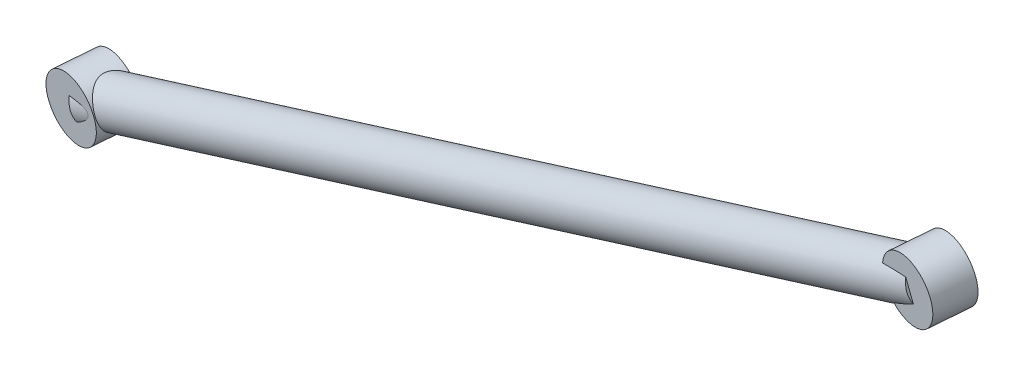
ISO-10303-21;
HEADER;
FILE_DESCRIPTION(('STEP AP214'),'2;1');
FILE_NAME('part.step','',(''),(''),'','','');
FILE_SCHEMA(('AUTOMOTIVE_DESIGN { 1 0 10303 214 1 1 1 1 }'));
ENDSEC;
DATA;
#1=APPLICATION_CONTEXT('core data for automotive mechanical design processes');
#2=APPLICATION_PROTOCOL_DEFINITION('international standard','automotive_design',2000,#1);
#3=PRODUCT_CONTEXT('',#1,'mechanical');
#4=PRODUCT('Part','Part','',(#3));
#5=PRODUCT_RELATED_PRODUCT_CATEGORY('part','',(#4));
#6=PRODUCT_DEFINITION_FORMATION('','',#4);
#7=PRODUCT_DEFINITION_CONTEXT('part definition',#1,'design');
#8=PRODUCT_DEFINITION('design','',#6,#7);
#9=PRODUCT_DEFINITION_SHAPE('','',#8);
#10=(LENGTH_UNIT() NAMED_UNIT(*) SI_UNIT(.MILLI.,.METRE.));
#11=(NAMED_UNIT(*) PLANE_ANGLE_UNIT() SI_UNIT($,.RADIAN.));
#12=(NAMED_UNIT(*) SI_UNIT($,.STERADIAN.) SOLID_ANGLE_UNIT());
#13=UNCERTAINTY_MEASURE_WITH_UNIT(LENGTH_MEASURE(1.E-05),#10,'distance_accuracy_value','');
#14=(GEOMETRIC_REPRESENTATION_CONTEXT(3) GLOBAL_UNCERTAINTY_ASSIGNED_CONTEXT((#13)) GLOBAL_UNIT_ASSIGNED_CONTEXT((#10,
#11,#12)) REPRESENTATION_CONTEXT('',''));
#15=CARTESIAN_POINT('',(0.,0.,0.));
#16=DIRECTION('',(0.,0.,1.));
#17=DIRECTION('',(1.,0.,0.));
#18=AXIS2_PLACEMENT_3D('',#15,#16,#17);
#19=CARTESIAN_POINT('',(-270.,-90.4,-82.3915));
#20=DIRECTION('',(-0.939705089189174,-0.336195624096405,-0.0626645648703886));
#21=DIRECTION('',(0.336857669052995,-0.941555580303246,0.));
#22=AXIS2_PLACEMENT_3D('',#19,#20,#21);
#23=PLANE('',#22);
#24=DIRECTION('',(0.338112197345584,-0.940832147772697,-0.0226938697351189));
#25=VECTOR('',#24,1.);
#26=CARTESIAN_POINT('',(-270.362363465706,-90.7001374074665,-75.3473327454949));
#27=LINE('',#26,#25);
#28=CARTESIAN_POINT('',(-271.63459650136,-87.1600174449255,-75.261941295525));
#29=VERTEX_POINT('',#28);
#30=CARTESIAN_POINT('',(-269.090130430052,-94.2402573700075,-75.4327241954648));
#31=VERTEX_POINT('',#30);
#32=EDGE_CURVE('E214',#29,#31,#27,.T.);
#33=ORIENTED_EDGE('',*,*,#32,.F.);
#34=CARTESIAN_POINT('',(-270.,-90.4,-82.3915));
#35=DIRECTION('',(-0.939705089189174,-0.336195624096405,-0.0626645648703886));
#36=DIRECTION('',(0.336857669052995,-0.941555580303246,0.));
#37=AXIS2_PLACEMENT_3D('',#34,#35,#36);
#38=CIRCLE('',#37,8.);
#39=EDGE_CURVE('E121',#31,#29,#38,.T.);
#40=ORIENTED_EDGE('',*,*,#39,.F.);
#41=EDGE_LOOP('',(#33,#40));
#42=FACE_BOUND('',#41,.T.);
#43=ADVANCED_FACE('F61',(#42),#23,.F.);
#44=CARTESIAN_POINT('',(-270.,-90.4,-82.3915));
#45=DIRECTION('',(-0.939705089189174,-0.336195624096405,-0.0626645648703886));
#46=DIRECTION('',(0.336857669052995,-0.941555580303246,0.));
#47=AXIS2_PLACEMENT_3D('',#44,#45,#46);
#48=CYLINDRICAL_SURFACE('',#47,8.);
#49=CARTESIAN_POINT('',(-539.674755458417,-186.880772273583,-100.374856056858));
#50=DIRECTION('',(0.173007213039323,0.0858414993815809,-0.981172635788569));
#51=DIRECTION('',(-0.925066833594974,-0.327820234026552,-0.191794805835157));
#52=AXIS2_PLACEMENT_3D('',#49,#50,#51);
#53=ELLIPSE('',#52,61.5618840675635,8.);
#54=CARTESIAN_POINT('',(-582.219895823248,-196.015189276846,-108.675870493402));
#55=VERTEX_POINT('',#54);
#56=CARTESIAN_POINT('',(-591.203386681192,-201.150245350511,-110.709161635756));
#57=VERTEX_POINT('',#56);
#58=EDGE_CURVE('E82',#55,#57,#53,.F.);
#59=ORIENTED_EDGE('',*,*,#58,.F.);
#60=CARTESIAN_POINT('',(-578.431216688687,-206.557581712691,-108.930164127866));
#61=CARTESIAN_POINT('',(-578.465471314096,-206.664204574838,-108.850979449071));
#62=CARTESIAN_POINT('',(-578.501082264131,-206.769053576288,-108.770026775622));
#63=CARTESIAN_POINT('',(-578.574695193326,-206.975091104074,-108.604637103492));
#64=CARTESIAN_POINT('',(-578.612697039367,-207.076279833709,-108.520200298885));
#65=CARTESIAN_POINT('',(-578.729864244891,-207.374335603785,-108.261613493853));
#66=CARTESIAN_POINT('',(-578.812145037565,-207.565550658355,-108.082292147673));
#67=CARTESIAN_POINT('',(-578.98331067072,-207.933872214126,-107.707834426768));
#68=CARTESIAN_POINT('',(-579.072264510419,-208.110775355817,-107.512530114629));
#69=CARTESIAN_POINT('',(-579.252827731725,-208.446161348542,-107.107909069177));
#70=CARTESIAN_POINT('',(-579.34443588166,-208.604652577441,-106.898598777795));
#71=CARTESIAN_POINT('',(-579.501244102317,-208.859333193131,-106.526442129415));
#72=CARTESIAN_POINT('',(-579.566628349518,-208.960511543836,-106.367075334759));
#73=CARTESIAN_POINT('',(-579.695590628034,-209.151144645031,-106.040692837079));
#74=CARTESIAN_POINT('',(-579.759168385134,-209.240597623047,-105.873675982765));
#75=CARTESIAN_POINT('',(-579.882653973903,-209.406076639585,-105.532738739074));
#76=CARTESIAN_POINT('',(-579.942576091007,-209.482157466062,-105.358850272871));
#77=CARTESIAN_POINT('',(-580.057329349324,-209.61980271955,-105.003815248785));
#78=CARTESIAN_POINT('',(-580.112162466615,-209.681372795554,-104.822671547581));
#79=CARTESIAN_POINT('',(-580.205242756482,-209.778193977928,-104.488969247869));
#80=CARTESIAN_POINT('',(-580.244659269166,-209.816224702873,-104.337542454799));
#81=CARTESIAN_POINT('',(-580.318222196723,-209.880901904138,-104.031076094397));
#82=CARTESIAN_POINT('',(-580.352371192049,-209.907553966022,-103.876038339125));
#83=CARTESIAN_POINT('',(-580.41475756279,-209.948814735832,-103.563255448569));
#84=CARTESIAN_POINT('',(-580.442997565913,-209.96342880554,-103.40551155061));
#85=CARTESIAN_POINT('',(-580.493205501915,-209.980206982525,-103.088363126329));
#86=CARTESIAN_POINT('',(-580.515173334427,-209.982370890584,-102.928958573475));
#87=CARTESIAN_POINT('',(-580.552786704783,-209.974134760701,-102.609727113327));
#88=CARTESIAN_POINT('',(-580.56843202125,-209.963734282879,-102.449900191441));
#89=CARTESIAN_POINT('',(-580.593690010908,-209.930580615436,-102.131066659283));
#90=CARTESIAN_POINT('',(-580.60330269151,-209.907827440991,-101.972060048004));
#91=CARTESIAN_POINT('',(-580.617086027815,-209.850417760069,-101.655796487974));
#92=CARTESIAN_POINT('',(-580.621250340782,-209.81574743936,-101.498541789405));
#93=CARTESIAN_POINT('',(-580.62490875589,-209.735158400902,-101.186818462794));
#94=CARTESIAN_POINT('',(-580.624400139515,-209.68923315062,-101.032351508904));
#95=CARTESIAN_POINT('',(-580.618843199258,-209.570520130163,-100.678159378328));
#96=CARTESIAN_POINT('',(-580.61239522951,-209.493838514549,-100.479756553055));
#97=CARTESIAN_POINT('',(-580.59508071918,-209.323970214876,-100.09044150861));
#98=CARTESIAN_POINT('',(-580.584214509682,-209.230784767837,-99.899528729342));
#99=CARTESIAN_POINT('',(-580.560102377258,-209.029353385694,-99.5256734879873));
#100=CARTESIAN_POINT('',(-580.546853236514,-208.921087131185,-99.3427422240896));
#101=CARTESIAN_POINT('',(-580.519858516923,-208.690977940987,-98.9857141288606));
#102=CARTESIAN_POINT('',(-580.506112973781,-208.569135980403,-98.8116166643282));
#103=CARTESIAN_POINT('',(-580.479488333555,-208.310071767392,-98.4688053814418));
#104=CARTESIAN_POINT('',(-580.466636627911,-208.172558975168,-98.3003091990798));
#105=CARTESIAN_POINT('',(-580.44374047284,-207.885560426421,-97.9735351670999));
#106=CARTESIAN_POINT('',(-580.433697060141,-207.73607027439,-97.8152611076845));
#107=CARTESIAN_POINT('',(-580.417837111463,-207.426117700684,-97.5095984353078));
#108=CARTESIAN_POINT('',(-580.412020745233,-207.26565483865,-97.3622102597147));
#109=CARTESIAN_POINT('',(-580.405882737456,-206.934755084924,-97.0790948415019));
#110=CARTESIAN_POINT('',(-580.405559045452,-206.764321939057,-96.9433632662151));
#111=CARTESIAN_POINT('',(-580.411966805188,-206.389281775072,-96.6657476671655));
#112=CARTESIAN_POINT('',(-580.419715154584,-206.183275926423,-96.5257657893436));
#113=CARTESIAN_POINT('',(-580.445364961334,-205.7608967788,-96.2633914179239));
#114=CARTESIAN_POINT('',(-580.463267512316,-205.544522365409,-96.141000820725));
#115=CARTESIAN_POINT('',(-580.510452433318,-205.103322241579,-95.9153779970097));
#116=CARTESIAN_POINT('',(-580.539728084515,-204.87850159158,-95.8121345121622));
#117=CARTESIAN_POINT('',(-580.610598148334,-204.422383993315,-95.6262386862508));
#118=CARTESIAN_POINT('',(-580.652190232843,-204.191088276474,-95.5435824591114));
#119=CARTESIAN_POINT('',(-580.742891593326,-203.750439445695,-95.4082334925534));
#120=CARTESIAN_POINT('',(-580.790645096812,-203.541516179919,-95.3532270684793));
#121=CARTESIAN_POINT('',(-580.89642378112,-203.122278048831,-95.261353493335));
#122=CARTESIAN_POINT('',(-580.954448236343,-202.911963282831,-95.2244850615884));
#123=CARTESIAN_POINT('',(-581.080534415993,-202.492049515574,-95.1694754005953));
#124=CARTESIAN_POINT('',(-581.148589234801,-202.282450122583,-95.151321355227));
#125=CARTESIAN_POINT('',(-581.294267651397,-201.865815283563,-95.1339697780195));
#126=CARTESIAN_POINT('',(-581.37189046872,-201.658779629922,-95.1347707010299));
#127=CARTESIAN_POINT('',(-581.526439324749,-201.272845695384,-95.1540818946693));
#128=CARTESIAN_POINT('',(-581.602411577443,-201.093458034986,-95.170537343052));
#129=CARTESIAN_POINT('',(-581.760524476377,-200.73938340072,-95.217983704321));
#130=CARTESIAN_POINT('',(-581.842665169094,-200.564696462285,-95.248974726739));
#131=CARTESIAN_POINT('',(-582.012286190222,-200.221110090847,-95.3250773703187));
#132=CARTESIAN_POINT('',(-582.099766264377,-200.05221038286,-95.3701883195268));
#133=CARTESIAN_POINT('',(-582.279166504602,-199.721075432315,-95.473984839043));
#134=CARTESIAN_POINT('',(-582.371086873842,-199.558840495339,-95.5326710309647));
#135=CARTESIAN_POINT('',(-582.560246705309,-199.2386313625,-95.6642614584665));
#136=CARTESIAN_POINT('',(-582.657555249429,-199.08080387155,-95.7374227977067));
#137=CARTESIAN_POINT('',(-582.854762679002,-198.773336771791,-95.8964915067411));
#138=CARTESIAN_POINT('',(-582.954662429295,-198.623699949907,-95.9824031784617));
#139=CARTESIAN_POINT('',(-583.155961079098,-198.333033837948,-96.1662292713843));
#140=CARTESIAN_POINT('',(-583.257360182067,-198.192005729624,-96.2641453349482));
#141=CARTESIAN_POINT('',(-583.460561506498,-197.918799623475,-96.4712659371272));
#142=CARTESIAN_POINT('',(-583.562363769333,-197.786622560237,-96.5804716647375));
#143=CARTESIAN_POINT('',(-583.778075933937,-197.515097858914,-96.82398204456));
#144=CARTESIAN_POINT('',(-583.891890763301,-197.376953697254,-96.9597146111942));
#145=CARTESIAN_POINT('',(-584.116925020827,-197.112101092072,-97.2437695452725));
#146=CARTESIAN_POINT('',(-584.228145205999,-196.985389281323,-97.3920881805384));
#147=CARTESIAN_POINT('',(-584.446393034493,-196.743113740487,-97.7008127684572));
#148=CARTESIAN_POINT('',(-584.553415686687,-196.627563056422,-97.861232485078));
#149=CARTESIAN_POINT('',(-584.761145499686,-196.407663320397,-98.1933306358741));
#150=CARTESIAN_POINT('',(-584.861855209076,-196.303309735808,-98.3650044686572));
#151=CARTESIAN_POINT('',(-585.047233689927,-196.113333797652,-98.7052275122182));
#152=CARTESIAN_POINT('',(-585.132541048588,-196.026884369464,-98.8729668744967));
#153=CARTESIAN_POINT('',(-585.293991966436,-195.86318142717,-99.2171605862033));
#154=CARTESIAN_POINT('',(-585.370135160341,-195.785928279629,-99.3936152826287));
#155=CARTESIAN_POINT('',(-585.510909586481,-195.640651169618,-99.7544145268025));
#156=CARTESIAN_POINT('',(-585.575557658788,-195.572613741769,-99.9387470340543));
#157=CARTESIAN_POINT('',(-585.690995492143,-195.445623384838,-100.314740167538));
#158=CARTESIAN_POINT('',(-585.741789241424,-195.386667843492,-100.506398666691));
#159=CARTESIAN_POINT('',(-585.817849050135,-195.289514312549,-100.854197670536));
#160=CARTESIAN_POINT('',(-585.846251365182,-195.249573523333,-101.009168196626));
#161=CARTESIAN_POINT('',(-585.891730553036,-195.175373663313,-101.322091237881));
#162=CARTESIAN_POINT('',(-585.908810165239,-195.141113219721,-101.480043022248));
#163=CARTESIAN_POINT('',(-585.930649258077,-195.078359246359,-101.797738836132));
#164=CARTESIAN_POINT('',(-585.935424253332,-195.04985849617,-101.957480353379));
#165=CARTESIAN_POINT('',(-585.932049123488,-194.998614545634,-102.27775989516));
#166=CARTESIAN_POINT('',(-585.923898930498,-194.975871375529,-102.438297923874));
#167=CARTESIAN_POINT('',(-585.894445434781,-194.936127634495,-102.759166525965));
#168=CARTESIAN_POINT('',(-585.873119058948,-194.91913721831,-102.919496239945));
#169=CARTESIAN_POINT('',(-585.817586159521,-194.890936212068,-103.238411669479));
#170=CARTESIAN_POINT('',(-585.783379726535,-194.879725581353,-103.396997397295));
#171=CARTESIAN_POINT('',(-585.70279034212,-194.863022458867,-103.711474326217));
#172=CARTESIAN_POINT('',(-585.65639736536,-194.857534693604,-103.867363195675));
#173=CARTESIAN_POINT('',(-585.552490844947,-194.852213156824,-104.17554492181));
#174=CARTESIAN_POINT('',(-585.494971584392,-194.85238229965,-104.327835884478));
#175=CARTESIAN_POINT('',(-585.349982456245,-194.859249492948,-104.676450115555));
#176=CARTESIAN_POINT('',(-585.258826891087,-194.868027368469,-104.87120319257));
#177=CARTESIAN_POINT('',(-585.062199291875,-194.895170182697,-105.252667332749));
#178=CARTESIAN_POINT('',(-584.956720520795,-194.913539644515,-105.439374556717));
#179=CARTESIAN_POINT('',(-584.733793708872,-194.959888753859,-105.805204548384));
#180=CARTESIAN_POINT('',(-584.616301279116,-194.98790501858,-105.984295452994));
#181=CARTESIAN_POINT('',(-584.372148581148,-195.053562459911,-106.33415709535));
#182=CARTESIAN_POINT('',(-584.245490680874,-195.091201156847,-106.504929963154));
#183=CARTESIAN_POINT('',(-583.968356083967,-195.181705215155,-106.859756066577));
#184=CARTESIAN_POINT('',(-583.81690643517,-195.235903365168,-107.042708805323));
#185=CARTESIAN_POINT('',(-583.507431030258,-195.357105886115,-107.398542876751));
#186=CARTESIAN_POINT('',(-583.349404449722,-195.424111866319,-107.571422940263));
#187=CARTESIAN_POINT('',(-583.030666782325,-195.570623712109,-107.905361150957));
#188=CARTESIAN_POINT('',(-582.87000252584,-195.649988125947,-108.066526017943));
#189=CARTESIAN_POINT('',(-582.546284470835,-195.822275341547,-108.378787380711));
#190=CARTESIAN_POINT('',(-582.383231358006,-195.915194318664,-108.529886699193));
#191=CARTESIAN_POINT('',(-582.219895823248,-196.015189276846,-108.675870493402));
#192=B_SPLINE_CURVE_WITH_KNOTS('',3,(#60,#61,#62,#63,#64,#65,#66,#67,#68,#69,#70,#71,#72,#73,
#74,#75,#76,#77,#78,#79,#80,#81,#82,#83,#84,#85,#86,#87,#88,#89,#90,#91,#92,#93,#94,#95,#96,#97,
#98,#99,#100,#101,#102,#103,#104,#105,#106,#107,#108,#109,#110,#111,#112,#113,#114,#115,#116,
#117,#118,#119,#120,#121,#122,#123,#124,#125,#126,#127,#128,#129,#130,#131,#132,#133,#134,#135,
#136,#137,#138,#139,#140,#141,#142,#143,#144,#145,#146,#147,#148,#149,#150,#151,#152,#153,#154,
#155,#156,#157,#158,#159,#160,#161,#162,#163,#164,#165,#166,#167,#168,#169,#170,#171,#172,#173,
#174,#175,#176,#177,#178,#179,#180,#181,#182,#183,#184,#185,#186,#187,#188,#189,#190,#191),
.UNSPECIFIED.,.F.,.F.,(4,2,2,2,2,2,2,2,2,2,2,2,2,2,2,2,2,2,2,2,2,2,2,2,2,2,2,2,2,2,2,2,2,2,2,2,
2,2,2,2,2,2,2,2,2,2,2,2,2,2,2,2,2,2,2,2,2,2,2,2,2,2,2,2,2,4),(0.,0.411404774381897,
0.822786663390249,1.64609557249676,2.47957034760304,3.31266437363438,3.91155860047472,
4.51054325544574,5.10701346206758,5.70325107949887,6.1858535807983,6.66821890873008,
7.15036927237951,7.63252735095421,8.11470231041384,8.59687667747804,9.07961187163429,
9.56262791899834,10.200096984601,10.8375182899318,11.4758068970846,12.114049687293,
12.7670536392459,13.4202983409896,14.0735692742512,14.7265963313102,15.4731335161019,
16.2197511198415,16.9659283174934,17.7119645589101,18.374794550198,19.037577734075,
19.6999067238352,20.3621817227751,20.9480117736716,21.5338462391139,22.1196528295024,
22.7054862494316,23.3028499466906,23.9004156529204,24.4980632055901,25.0957737650511,
25.7689904977842,26.4420082928597,27.1158034794858,27.7893248739544,28.4100530804595,
29.0308060209511,29.6506419436517,30.270299245924,30.7574347076644,31.2444522695907,
31.7308554606366,32.2172612065494,32.7045211320007,33.1917776297777,33.6794362341598,
34.167346075873,34.8119870196237,35.4569322321535,36.1043530093149,36.7516071157356,
37.4817616384408,38.2120079635097,38.9344390042006,39.6566665918585),.UNSPECIFIED.);
#193=CARTESIAN_POINT('',(-578.431216688687,-206.557581712691,-108.930164127866));
#194=VERTEX_POINT('',#193);
#195=EDGE_CURVE('E12',#194,#55,#192,.T.);
#196=ORIENTED_EDGE('',*,*,#195,.F.);
#197=CARTESIAN_POINT('',(-588.658920356653,-208.230485995303,-110.879944471863));
#198=VERTEX_POINT('',#197);
#199=EDGE_CURVE('E123',#198,#194,#53,.F.);
#200=ORIENTED_EDGE('',*,*,#199,.F.);
#201=CARTESIAN_POINT('',(-590.293517,-204.990503,-103.750386));
#202=DIRECTION('',(-0.939705089189174,-0.336195624096405,-0.0626645648703886));
#203=DIRECTION('',(0.336857669052995,-0.941555580303246,0.));
#204=AXIS2_PLACEMENT_3D('',#201,#202,#203);
#205=CIRCLE('',#204,8.);
#206=EDGE_CURVE('E116',#57,#198,#205,.T.);
#207=ORIENTED_EDGE('',*,*,#206,.F.);
#208=EDGE_LOOP('',(#59,#196,#200,#207));
#209=FACE_BOUND('',#208,.T.);
#210=CARTESIAN_POINT('',(-278.073620946412,-99.3753126154452,-77.4660144763714));
#211=CARTESIAN_POINT('',(-277.980578554394,-99.432272832786,-77.549144941356));
#212=CARTESIAN_POINT('',(-277.887645633137,-99.486928181705,-77.6339450181131));
#213=CARTESIAN_POINT('',(-277.702317759785,-99.5917491103753,-77.8068329049813));
#214=CARTESIAN_POINT('',(-277.609922778051,-99.6419149397121,-77.8949205319416));
#215=CARTESIAN_POINT('',(-277.333885822736,-99.7859307747222,-78.1641705430819));
#216=CARTESIAN_POINT('',(-277.151515956817,-99.873223974671,-78.3502097848261));
#217=CARTESIAN_POINT('',(-276.790900875206,-100.032065204438,-78.7373831933288));
#218=CARTESIAN_POINT('',(-276.61273439345,-100.103405510797,-78.9386753816846));
#219=CARTESIAN_POINT('',(-276.266287321803,-100.229608560758,-79.3544304067903));
#220=CARTESIAN_POINT('',(-276.098002253013,-100.284478816766,-79.568887184908));
#221=CARTESIAN_POINT('',(-275.820726472725,-100.365011622857,-79.9491295337109));
#222=CARTESIAN_POINT('',(-275.708366252942,-100.394548731121,-80.111649340968));
#223=CARTESIAN_POINT('',(-275.49261515193,-100.445414413786,-80.4438570822435));
#224=CARTESIAN_POINT('',(-275.389225627562,-100.466741748091,-80.6135460948861));
#225=CARTESIAN_POINT('',(-275.193925758561,-100.501093295655,-80.9593035059852));
#226=CARTESIAN_POINT('',(-275.101969047983,-100.514151988338,-81.1353421344891));
#227=CARTESIAN_POINT('',(-274.931329519675,-100.532015960187,-81.4941282540374));
#228=CARTESIAN_POINT('',(-274.85264153987,-100.536824455726,-81.6768731022418));
#229=CARTESIAN_POINT('',(-274.724365148851,-100.537939993114,-82.0129377720941));
#230=CARTESIAN_POINT('',(-274.672088953527,-100.535692640918,-82.1652277042377));
#231=CARTESIAN_POINT('',(-274.578899963037,-100.525626938949,-82.4730113656233));
#232=CARTESIAN_POINT('',(-274.537981595993,-100.517811327568,-82.628503483589));
#233=CARTESIAN_POINT('',(-274.468408544746,-100.496548185919,-82.9417687545921));
#234=CARTESIAN_POINT('',(-274.439748403394,-100.483103167053,-83.0995408602115));
#235=CARTESIAN_POINT('',(-274.395212467391,-100.450542009661,-83.4163086017324));
#236=CARTESIAN_POINT('',(-274.379336877309,-100.431425780394,-83.5753042571712));
#237=CARTESIAN_POINT('',(-274.360462300716,-100.38751922761,-83.8932780039125));
#238=CARTESIAN_POINT('',(-274.357463765106,-100.362728705434,-84.052256094405));
#239=CARTESIAN_POINT('',(-274.363966412342,-100.307505071426,-84.3689578993502));
#240=CARTESIAN_POINT('',(-274.373467579829,-100.277071966525,-84.5266816153437));
#241=CARTESIAN_POINT('',(-274.404213890526,-100.210573263821,-84.8399564031231));
#242=CARTESIAN_POINT('',(-274.425472680545,-100.174501155919,-84.9955047344843));
#243=CARTESIAN_POINT('',(-274.478706306272,-100.096782181777,-85.3034095349832));
#244=CARTESIAN_POINT('',(-274.510687369333,-100.055132084377,-85.4557640944584));
#245=CARTESIAN_POINT('',(-274.595936081353,-99.9520944825289,-85.8046073787172));
#246=CARTESIAN_POINT('',(-274.652740385054,-99.888654373036,-85.9996303182871));
#247=CARTESIAN_POINT('',(-274.780143100984,-99.7521908217249,-86.3815563133688));
#248=CARTESIAN_POINT('',(-274.850740479415,-99.6791680982632,-86.5684599761424));
#249=CARTESIAN_POINT('',(-275.003230227998,-99.5233754589611,-86.9336985987398));
#250=CARTESIAN_POINT('',(-275.085137835881,-99.4405924158787,-87.1120215536098));
#251=CARTESIAN_POINT('',(-275.257838080748,-99.2652608929123,-87.4592699959457));
#252=CARTESIAN_POINT('',(-275.348630079535,-99.1727131144264,-87.6281961570513));
#253=CARTESIAN_POINT('',(-275.539248269245,-98.9754483035903,-87.9600003106212));
#254=CARTESIAN_POINT('',(-275.63923483703,-98.8704993264099,-88.1226480642641));
#255=CARTESIAN_POINT('',(-275.844503119216,-98.6500285672016,-88.4371814130413));
#256=CARTESIAN_POINT('',(-275.949786772243,-98.5345029014526,-88.5890630182704));
#257=CARTESIAN_POINT('',(-276.163907292931,-98.2927749356648,-88.881418590088));
#258=CARTESIAN_POINT('',(-276.272744303105,-98.1665722070814,-89.0218920983464));
#259=CARTESIAN_POINT('',(-276.492346575962,-97.9034855827796,-89.2906799591509));
#260=CARTESIAN_POINT('',(-276.603111103629,-97.7666056920945,-89.4189988313211));
#261=CARTESIAN_POINT('',(-276.841034410575,-97.4617694342173,-89.6802151304815));
#262=CARTESIAN_POINT('',(-276.968269560137,-97.2921697664279,-89.8111370314712));
#263=CARTESIAN_POINT('',(-277.221234141052,-96.9392756286533,-90.0548110436786));
#264=CARTESIAN_POINT('',(-277.34696340873,-96.7559796853954,-90.1675611960788));
#265=CARTESIAN_POINT('',(-277.594726828656,-96.3764556158857,-90.3733873393828));
#266=CARTESIAN_POINT('',(-277.716763116788,-96.1802351816937,-90.4664748962172));
#267=CARTESIAN_POINT('',(-277.955137805681,-95.7758473458073,-90.6316144785296));
#268=CARTESIAN_POINT('',(-278.071477278444,-95.5676822079512,-90.7036704743925));
#269=CARTESIAN_POINT('',(-278.283937755359,-95.1647519435923,-90.8186714781558));
#270=CARTESIAN_POINT('',(-278.380866579226,-94.9710817037655,-90.8639669485159));
#271=CARTESIAN_POINT('',(-278.56740804973,-94.5769088360757,-90.9362202444095));
#272=CARTESIAN_POINT('',(-278.657021212533,-94.3764066916647,-90.9631793646757));
#273=CARTESIAN_POINT('',(-278.827762417153,-93.9703676208983,-90.9982662224424));
#274=CARTESIAN_POINT('',(-278.908896231599,-93.7648342389545,-91.0064068521191));
#275=CARTESIAN_POINT('',(-279.06186075604,-93.3504642558238,-91.003713764554));
#276=CARTESIAN_POINT('',(-279.133692223854,-93.1416279252702,-90.9928815939839));
#277=CARTESIAN_POINT('',(-279.259719470945,-92.7468298697815,-90.9547383643238));
#278=CARTESIAN_POINT('',(-279.314993846905,-92.5610102275176,-90.929473751195));
#279=CARTESIAN_POINT('',(-279.417570840208,-92.1896883028163,-90.8645301009247));
#280=CARTESIAN_POINT('',(-279.464873397478,-92.0041860227809,-90.8248509551648));
#281=CARTESIAN_POINT('',(-279.551460941654,-91.6348455834657,-90.7315518057676));
#282=CARTESIAN_POINT('',(-279.590746309944,-91.4510073454241,-90.6779324655509));
#283=CARTESIAN_POINT('',(-279.661443793053,-91.0862195265969,-90.5573495951192));
#284=CARTESIAN_POINT('',(-279.6928555472,-90.9052700784954,-90.4903854538619));
#285=CARTESIAN_POINT('',(-279.74864718254,-90.5438764275214,-90.3423540908641));
#286=CARTESIAN_POINT('',(-279.772876495742,-90.3635122637606,-90.2610352352308));
#287=CARTESIAN_POINT('',(-279.813932190135,-90.0079875811188,-90.0859745117182));
#288=CARTESIAN_POINT('',(-279.830756065123,-89.8328288425672,-89.9922284520798));
#289=CARTESIAN_POINT('',(-279.857587004792,-89.4887007707752,-89.7930905016185));
#290=CARTESIAN_POINT('',(-279.867593135485,-89.3197322885587,-89.6876970174718));
#291=CARTESIAN_POINT('',(-279.881490650415,-88.9888384035677,-89.4660049351665));
#292=CARTESIAN_POINT('',(-279.885381389895,-88.8269137451856,-89.3497051885112));
#293=CARTESIAN_POINT('',(-279.88800036101,-88.4909094488556,-89.0915406210879));
#294=CARTESIAN_POINT('',(-279.886014346398,-88.3178783464489,-88.9483022068303));
#295=CARTESIAN_POINT('',(-279.876575539452,-87.9828142606333,-88.6497767059618));
#296=CARTESIAN_POINT('',(-279.869124362742,-87.8207780423561,-88.4944931922783));
#297=CARTESIAN_POINT('',(-279.850177912041,-87.5084768139419,-88.1723916855413));
#298=CARTESIAN_POINT('',(-279.838677976721,-87.3582256167304,-88.0055605763779));
#299=CARTESIAN_POINT('',(-279.813250212841,-87.0708509487369,-87.6612264908571));
#300=CARTESIAN_POINT('',(-279.799323372738,-86.9337221684031,-87.4837278784851));
#301=CARTESIAN_POINT('',(-279.771973915239,-86.6839658470831,-87.1328980489916));
#302=CARTESIAN_POINT('',(-279.758597341439,-86.5702603283669,-86.960330726449));
#303=CARTESIAN_POINT('',(-279.732928474149,-86.3561354672575,-86.6070233821119));
#304=CARTESIAN_POINT('',(-279.720636223886,-86.2557166544581,-86.4262830349345));
#305=CARTESIAN_POINT('',(-279.698938778662,-86.0696495328845,-86.0574913829113));
#306=CARTESIAN_POINT('',(-279.689529345578,-85.9839796232868,-85.86945127273));
#307=CARTESIAN_POINT('',(-279.675508088413,-85.8287676449051,-85.4866510771364));
#308=CARTESIAN_POINT('',(-279.670894882567,-85.759220935612,-85.2918929438615));
#309=CARTESIAN_POINT('',(-279.668698349207,-85.6508420744092,-84.939136260059));
#310=CARTESIAN_POINT('',(-279.669822585538,-85.6086220993389,-84.7821839336391));
#311=CARTESIAN_POINT('',(-279.677146504688,-85.5358916862811,-84.4657167848974));
#312=CARTESIAN_POINT('',(-279.683344959046,-85.5053784167442,-84.3062025919623));
#313=CARTESIAN_POINT('',(-279.701548634204,-85.4567090741446,-83.985819131104));
#314=CARTESIAN_POINT('',(-279.713546519919,-85.4385374610686,-83.8249518264513));
#315=CARTESIAN_POINT('',(-279.743836961066,-85.414886600557,-83.5028657384382));
#316=CARTESIAN_POINT('',(-279.762129549561,-85.4094074197888,-83.3416469532362));
#317=CARTESIAN_POINT('',(-279.805210177943,-85.4112320862022,-83.0198636916977));
#318=CARTESIAN_POINT('',(-279.830009568167,-85.4185583987301,-82.8593008615901));
#319=CARTESIAN_POINT('',(-279.885893144357,-85.4457834537845,-82.5403618732817));
#320=CARTESIAN_POINT('',(-279.916977286111,-85.4656821078684,-82.3819856997064));
#321=CARTESIAN_POINT('',(-279.984941447232,-85.5175160787002,-82.0683561423029));
#322=CARTESIAN_POINT('',(-280.021826228451,-85.5494613150947,-81.9131054434009));
#323=CARTESIAN_POINT('',(-280.10063179403,-85.6246287315227,-81.6066084494379));
#324=CARTESIAN_POINT('',(-280.142555163105,-85.6678567128579,-81.4553642586171));
#325=CARTESIAN_POINT('',(-280.244675089168,-85.7802773364182,-81.109627390249));
#326=CARTESIAN_POINT('',(-280.306415529504,-85.8533499680932,-80.9168486592707));
#327=CARTESIAN_POINT('',(-280.434963561311,-86.0156453543467,-80.5399540157328));
#328=CARTESIAN_POINT('',(-280.501773530708,-86.1048757154586,-80.3558422349467));
#329=CARTESIAN_POINT('',(-280.638628352713,-86.2980305918756,-79.9957893723006));
#330=CARTESIAN_POINT('',(-280.708684637805,-86.4020101947706,-79.8198823655699));
#331=CARTESIAN_POINT('',(-280.849873100061,-86.6228611735343,-79.4769316425181));
#332=CARTESIAN_POINT('',(-280.921004995608,-86.7397292236848,-79.3098856561107));
#333=CARTESIAN_POINT('',(-281.071750540668,-87.0009159825,-78.9635425188726));
#334=CARTESIAN_POINT('',(-281.151283636549,-87.1468334074743,-78.7854165878803));
#335=CARTESIAN_POINT('',(-281.307429437355,-87.4522870423057,-78.4398735516443));
#336=CARTESIAN_POINT('',(-281.384041773839,-87.6118249621639,-78.2724577956513));
#337=CARTESIAN_POINT('',(-281.531565980257,-87.9417329599186,-77.9500110178222));
#338=CARTESIAN_POINT('',(-281.602530083055,-88.1119688358927,-77.7948666267837));
#339=CARTESIAN_POINT('',(-281.737829951002,-88.4639753627884,-77.4952515106217));
#340=CARTESIAN_POINT('',(-281.802167577226,-88.6457427517321,-77.3507777918363));
#341=CARTESIAN_POINT('',(-281.862299710489,-88.8329222290246,-77.2117208335654));
#342=B_SPLINE_CURVE_WITH_KNOTS('',3,(#210,#211,#212,#213,#214,#215,#216,#217,#218,#219,#220,
#221,#222,#223,#224,#225,#226,#227,#228,#229,#230,#231,#232,#233,#234,#235,#236,#237,#238,#239,
#240,#241,#242,#243,#244,#245,#246,#247,#248,#249,#250,#251,#252,#253,#254,#255,#256,#257,#258,
#259,#260,#261,#262,#263,#264,#265,#266,#267,#268,#269,#270,#271,#272,#273,#274,#275,#276,#277,
#278,#279,#280,#281,#282,#283,#284,#285,#286,#287,#288,#289,#290,#291,#292,#293,#294,#295,#296,
#297,#298,#299,#300,#301,#302,#303,#304,#305,#306,#307,#308,#309,#310,#311,#312,#313,#314,#315,
#316,#317,#318,#319,#320,#321,#322,#323,#324,#325,#326,#327,#328,#329,#330,#331,#332,#333,#334,
#335,#336,#337,#338,#339,#340,#341),.UNSPECIFIED.,.F.,.F.,(4,2,2,2,2,2,2,2,2,2,2,2,2,2,2,2,2,2,
2,2,2,2,2,2,2,2,2,2,2,2,2,2,2,2,2,2,2,2,2,2,2,2,2,2,2,2,2,2,2,2,2,2,2,2,2,2,2,2,2,2,2,2,2,2,2,
4),(0.,0.411404772506292,0.822786659586878,1.64609556356213,2.47957032866597,3.31266434520401,
3.91155867577401,4.5105434345729,5.10701374540336,5.70325146694684,6.18585400041388,
6.66821936047212,7.15036975572154,7.6325278658852,8.1147028591248,8.59687725996755,
9.07961248795264,9.56262856917862,10.2000976052731,10.8375188810375,11.4758074584866,
12.1140502190204,12.7670541399298,13.4202988106065,14.0735697129794,14.7265967392117,
15.4731339363273,16.2197515524228,16.9659287625594,17.7119650164539,18.3747950317765,
19.0375782397009,19.6999072532082,20.3621822758484,20.9480123198235,21.5338467783218,
22.1196533617807,22.7054867747752,23.3028504438505,23.9004161218801,24.4980636460765,
25.0957741770752,25.7689908801305,26.4420086455929,27.1158038030713,27.789325168566,
28.410053489275,29.0308065440954,29.6506425812909,30.2702999978834,30.7574354677688,
31.2444530377797,31.7308562363851,32.2172619898394,32.7045219270435,33.191778436559,
33.6794370521786,34.1673469051668,34.811987719682,35.4569328028474,36.1043534527623,
36.7516074322533,37.481762662912,38.2120096969504,38.9344414303082,39.656669709126),.UNSPECIFIED.);
#343=CARTESIAN_POINT('',(-278.073620946412,-99.3753126154452,-77.4660144763714));
#344=VERTEX_POINT('',#343);
#345=CARTESIAN_POINT('',(-281.862299710489,-88.8329222290246,-77.2117208335653));
#346=VERTEX_POINT('',#345);
#347=EDGE_CURVE('E141',#344,#346,#342,.T.);
#348=ORIENTED_EDGE('',*,*,#347,.F.);
#349=CARTESIAN_POINT('',(-320.618790794345,-108.509741192095,-85.7670318938731));
#350=DIRECTION('',(0.17300714396088,0.0858414862619328,-0.981172649116781));
#351=DIRECTION('',(-0.925066846311466,-0.327820238779969,-0.191794736376168));
#352=AXIS2_PLACEMENT_3D('',#349,#350,#351);
#353=ELLIPSE('',#352,61.5619173043896,8.);
#354=EDGE_CURVE('E136',#344,#31,#353,.F.);
#355=ORIENTED_EDGE('',*,*,#354,.T.);
#356=ORIENTED_EDGE('',*,*,#39,.T.);
#357=EDGE_CURVE('E139',#29,#346,#353,.F.);
#358=ORIENTED_EDGE('',*,*,#357,.T.);
#359=EDGE_LOOP('',(#348,#355,#356,#358));
#360=FACE_BOUND('',#359,.T.);
#361=ADVANCED_FACE('F124',(#209,#360),#48,.T.);
#362=CARTESIAN_POINT('',(-590.293517,-204.990503,-103.750386));
#363=DIRECTION('',(-0.939705089189174,-0.336195624096405,-0.0626645648703886));
#364=DIRECTION('',(0.336857669052995,-0.941555580303246,0.));
#365=AXIS2_PLACEMENT_3D('',#362,#363,#364);
#366=PLANE('',#365);
#367=DIRECTION('',(0.338112196791146,-0.940832148231925,-0.0226938589571316));
#368=VECTOR('',#367,1.);
#369=CARTESIAN_POINT('',(-589.931153518923,-204.690365672907,-110.794553053809));
#370=LINE('',#369,#368);
#371=EDGE_CURVE('E119',#57,#198,#370,.T.);
#372=ORIENTED_EDGE('',*,*,#371,.F.);
#373=ORIENTED_EDGE('',*,*,#206,.T.);
#374=EDGE_LOOP('',(#372,#373));
#375=FACE_BOUND('',#374,.T.);
#376=ADVANCED_FACE('F117',(#375),#366,.T.);
#377=CARTESIAN_POINT('',(-268.78895,-89.7991096,-89.2597085));
#378=DIRECTION('',(0.17300714396088,0.0858414862619328,-0.981172649116781));
#379=DIRECTION('',(-0.984807764479994,0.,-0.173648112629874));
#380=AXIS2_PLACEMENT_3D('',#377,#378,#379);
#381=PLANE('',#380);
#382=CARTESIAN_POINT('',(-268.78895,-89.7991096,-89.2597085));
#383=DIRECTION('',(0.17300714396088,0.0858414862619328,-0.981172649116781));
#384=DIRECTION('',(-0.984807764479994,0.,-0.173648112629874));
#385=AXIS2_PLACEMENT_3D('',#382,#383,#384);
#386=CIRCLE('',#385,11.);
#387=CARTESIAN_POINT('',(-279.62183540928,-89.7991096,-91.1698377389286));
#388=VERTEX_POINT('',#387);
#389=EDGE_CURVE('E208',#388,#388,#386,.T.);
#390=ORIENTED_EDGE('',*,*,#389,.T.);
#391=EDGE_LOOP('',(#390));
#392=FACE_BOUND('',#391,.T.);
#393=DIRECTION('',(0.338112197345584,-0.940832147772697,-0.0226938697351189));
#394=VECTOR('',#393,1.);
#395=CARTESIAN_POINT('',(-269.637636534294,-90.0998625925335,-89.4356672545051));
#396=LINE('',#395,#394);
#397=CARTESIAN_POINT('',(-270.909869569948,-86.5597426299925,-89.3502758045352));
#398=VERTEX_POINT('',#397);
#399=CARTESIAN_POINT('',(-268.36540349864,-93.6399825550745,-89.5210587044751));
#400=VERTEX_POINT('',#399);
#401=EDGE_CURVE('E211',#398,#400,#396,.T.);
#402=ORIENTED_EDGE('',*,*,#401,.F.);
#403=CARTESIAN_POINT('',(-219.381209205655,-72.2902588079052,-79.0159681061269));
#404=DIRECTION('',(0.17300714396088,0.0858414862619328,-0.981172649116781));
#405=DIRECTION('',(-0.925066846311466,-0.327820238779969,-0.191794736376168));
#406=AXIS2_PLACEMENT_3D('',#403,#404,#405);
#407=ELLIPSE('',#406,61.5619173043896,8.);
#408=EDGE_CURVE('E132',#398,#400,#407,.F.);
#409=ORIENTED_EDGE('',*,*,#408,.T.);
#410=EDGE_LOOP('',(#402,#409));
#411=FACE_BOUND('',#410,.T.);
#412=ADVANCED_FACE('F159',(#392,#411),#381,.T.);
#413=CARTESIAN_POINT('',(-271.21105,-91.0008904,-75.5232915));
#414=DIRECTION('',(0.17300714396088,0.0858414862619328,-0.981172649116781));
#415=DIRECTION('',(-0.984807764479994,0.,-0.173648112629874));
#416=AXIS2_PLACEMENT_3D('',#413,#414,#415);
#417=PLANE('',#416);
#418=ORIENTED_EDGE('',*,*,#354,.F.);
#419=CARTESIAN_POINT('',(-271.21105,-91.0008904,-75.5232915));
#420=DIRECTION('',(0.17300714396088,0.0858414862619328,-0.981172649116781));
#421=DIRECTION('',(-0.984807764479994,0.,-0.173648112629874));
#422=AXIS2_PLACEMENT_3D('',#419,#420,#421);
#423=CIRCLE('',#422,11.);
#424=EDGE_CURVE('E205',#346,#344,#423,.T.);
#425=ORIENTED_EDGE('',*,*,#424,.F.);
#426=ORIENTED_EDGE('',*,*,#357,.F.);
#427=ORIENTED_EDGE('',*,*,#32,.T.);
#428=EDGE_LOOP('',(#418,#425,#426,#427));
#429=FACE_BOUND('',#428,.T.);
#430=ADVANCED_FACE('F157',(#429),#417,.F.);
#431=CARTESIAN_POINT('',(-271.21105,-91.0008904,-75.5232915));
#432=DIRECTION('',(0.173007143960884,0.0858414862619337,-0.98117264911678));
#433=DIRECTION('',(-0.984807764479993,0.,-0.173648112629878));
#434=AXIS2_PLACEMENT_3D('',#431,#432,#433);
#435=CYLINDRICAL_SURFACE('',#434,11.);
#436=ORIENTED_EDGE('',*,*,#389,.F.);
#437=EDGE_LOOP('',(#436));
#438=FACE_BOUND('',#437,.T.);
#439=ORIENTED_EDGE('',*,*,#424,.T.);
#440=ORIENTED_EDGE('',*,*,#347,.T.);
#441=EDGE_LOOP('',(#439,#440));
#442=FACE_BOUND('',#441,.T.);
#443=ADVANCED_FACE('F152',(#438,#442),#435,.T.);
#444=ORIENTED_EDGE('',*,*,#408,.F.);
#445=EDGE_CURVE('E216',#398,#400,#38,.T.);
#446=ORIENTED_EDGE('',*,*,#445,.T.);
#447=EDGE_LOOP('',(#444,#446));
#448=FACE_BOUND('',#447,.T.);
#449=ADVANCED_FACE('F149',(#448),#48,.T.);
#450=ORIENTED_EDGE('',*,*,#445,.F.);
#451=ORIENTED_EDGE('',*,*,#401,.T.);
#452=EDGE_LOOP('',(#450,#451));
#453=FACE_BOUND('',#452,.T.);
#454=ADVANCED_FACE('F63',(#453),#23,.F.);
#455=CARTESIAN_POINT('',(-591.504567,-205.591393,-96.882177));
#456=DIRECTION('',(0.173007213039323,0.0858414993815809,-0.981172635788569));
#457=DIRECTION('',(-0.984807752219736,0.,-0.17364818216126));
#458=AXIS2_PLACEMENT_3D('',#455,#456,#457);
#459=PLANE('',#458);
#460=CARTESIAN_POINT('',(-640.912283764889,-223.100235595144,-107.12591629146));
#461=DIRECTION('',(0.173007213039323,0.0858414993815809,-0.981172635788569));
#462=DIRECTION('',(-0.925066833594974,-0.327820234026552,-0.191794805835157));
#463=AXIS2_PLACEMENT_3D('',#460,#461,#462);
#464=ELLIPSE('',#463,61.5618840675635,8.);
#465=CARTESIAN_POINT('',(-589.383647818348,-208.830759394483,-96.7916096063434));
#466=VERTEX_POINT('',#465);
#467=CARTESIAN_POINT('',(-591.92811321859,-201.750521321645,-96.6208268322749));
#468=VERTEX_POINT('',#467);
#469=EDGE_CURVE('E202',#466,#468,#464,.F.);
#470=ORIENTED_EDGE('',*,*,#469,.F.);
#471=DIRECTION('',(0.338112196791146,-0.940832148231925,-0.0226938589571316));
#472=VECTOR('',#471,1.);
#473=CARTESIAN_POINT('',(-590.655880518469,-205.290640358064,-96.7062182193092));
#474=LINE('',#473,#472);
#475=EDGE_CURVE('E75',#468,#466,#474,.T.);
#476=ORIENTED_EDGE('',*,*,#475,.F.);
#477=EDGE_LOOP('',(#470,#476));
#478=FACE_BOUND('',#477,.T.);
#479=CARTESIAN_POINT('',(-591.504567,-205.591393,-96.882177));
#480=DIRECTION('',(0.173007213039323,0.0858414993815809,-0.981172635788569));
#481=DIRECTION('',(-0.984807752219736,0.,-0.17364818216126));
#482=AXIS2_PLACEMENT_3D('',#479,#480,#481);
#483=CIRCLE('',#482,11.);
#484=CARTESIAN_POINT('',(-602.337452274417,-205.591393,-98.7923070037738));
#485=VERTEX_POINT('',#484);
#486=EDGE_CURVE('E197',#485,#485,#483,.T.);
#487=ORIENTED_EDGE('',*,*,#486,.F.);
#488=EDGE_LOOP('',(#487));
#489=FACE_BOUND('',#488,.T.);
#490=ADVANCED_FACE('F160',(#478,#489),#459,.F.);
#491=CARTESIAN_POINT('',(-589.082466,-204.389612,-110.618594));
#492=DIRECTION('',(0.173007213039323,0.0858414993815809,-0.981172635788569));
#493=DIRECTION('',(-0.984807752219736,0.,-0.17364818216126));
#494=AXIS2_PLACEMENT_3D('',#491,#492,#493);
#495=PLANE('',#494);
#496=CARTESIAN_POINT('',(-589.082466,-204.389612,-110.618594));
#497=DIRECTION('',(0.173007213039323,0.0858414993815809,-0.981172635788569));
#498=DIRECTION('',(-0.984807752219736,0.,-0.17364818216126));
#499=AXIS2_PLACEMENT_3D('',#496,#497,#498);
#500=CIRCLE('',#499,11.);
#501=EDGE_CURVE('E129',#194,#55,#500,.T.);
#502=ORIENTED_EDGE('',*,*,#501,.T.);
#503=ORIENTED_EDGE('',*,*,#58,.T.);
#504=ORIENTED_EDGE('',*,*,#371,.T.);
#505=ORIENTED_EDGE('',*,*,#199,.T.);
#506=EDGE_LOOP('',(#502,#503,#504,#505));
#507=FACE_BOUND('',#506,.T.);
#508=ADVANCED_FACE('F131',(#507),#495,.T.);
#509=CARTESIAN_POINT('',(-591.504567,-205.591393,-96.882177));
#510=DIRECTION('',(0.173007213039331,0.0858414993815806,-0.981172635788568));
#511=DIRECTION('',(-0.984807752219735,0.,-0.173648182161267));
#512=AXIS2_PLACEMENT_3D('',#509,#510,#511);
#513=CYLINDRICAL_SURFACE('',#512,11.);
#514=ORIENTED_EDGE('',*,*,#501,.F.);
#515=ORIENTED_EDGE('',*,*,#195,.T.);
#516=EDGE_LOOP('',(#514,#515));
#517=FACE_BOUND('',#516,.T.);
#518=ORIENTED_EDGE('',*,*,#486,.T.);
#519=EDGE_LOOP('',(#518));
#520=FACE_BOUND('',#519,.T.);
#521=ADVANCED_FACE('F179',(#517,#520),#513,.T.);
#522=EDGE_CURVE('E120',#466,#468,#205,.T.);
#523=ORIENTED_EDGE('',*,*,#522,.T.);
#524=ORIENTED_EDGE('',*,*,#475,.T.);
#525=EDGE_LOOP('',(#523,#524));
#526=FACE_BOUND('',#525,.T.);
#527=ADVANCED_FACE('F184',(#526),#366,.T.);
#528=ORIENTED_EDGE('',*,*,#522,.F.);
#529=ORIENTED_EDGE('',*,*,#469,.T.);
#530=EDGE_LOOP('',(#528,#529));
#531=FACE_BOUND('',#530,.T.);
#532=ADVANCED_FACE('F171',(#531),#48,.T.);
#533=CLOSED_SHELL('',(#43,#361,#376,#412,#430,#443,#449,#454,#490,#508,#521,#527,#532));
#534=MANIFOLD_SOLID_BREP('B2',#533);
#535=ADVANCED_BREP_SHAPE_REPRESENTATION('',(#18,#534),#14);
#536=SHAPE_DEFINITION_REPRESENTATION(#9,#535);
ENDSEC;
END-ISO-10303-21;
